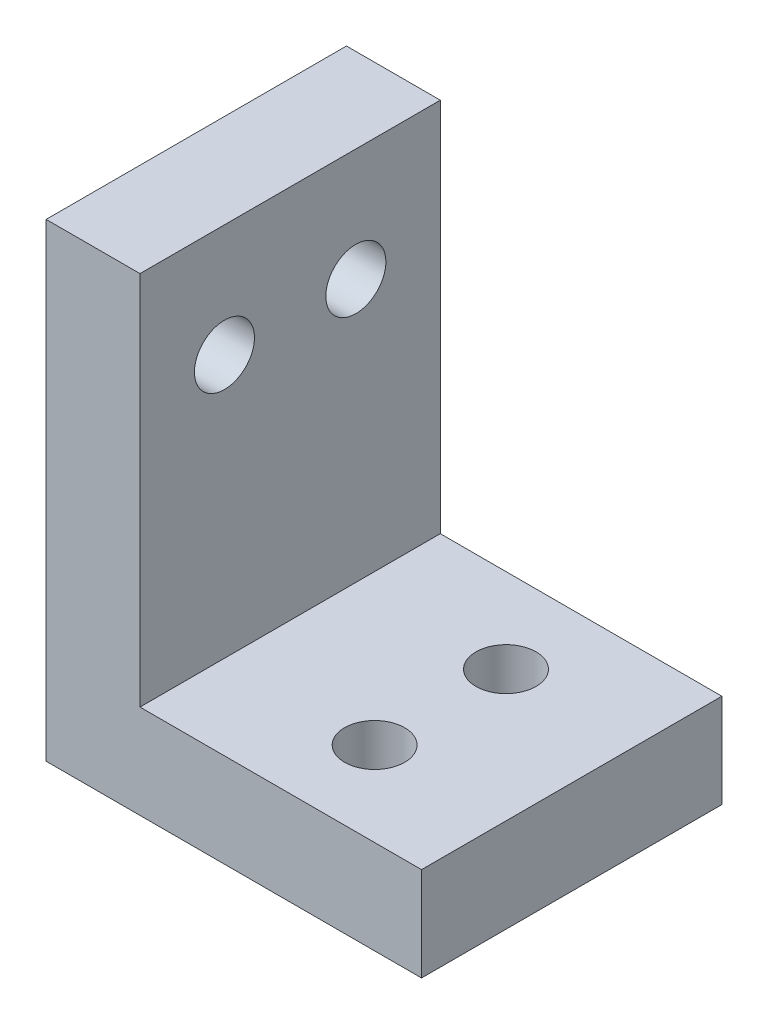
ISO-10303-21;
HEADER;
FILE_DESCRIPTION(('STEP AP214'),'2;1');
FILE_NAME('part.step','',(''),(''),'','','');
FILE_SCHEMA(('AUTOMOTIVE_DESIGN { 1 0 10303 214 1 1 1 1 }'));
ENDSEC;
DATA;
#1=APPLICATION_CONTEXT('core data for automotive mechanical design processes');
#2=APPLICATION_PROTOCOL_DEFINITION('international standard','automotive_design',2000,#1);
#3=PRODUCT_CONTEXT('',#1,'mechanical');
#4=PRODUCT('Part','Part','',(#3));
#5=PRODUCT_RELATED_PRODUCT_CATEGORY('part','',(#4));
#6=PRODUCT_DEFINITION_FORMATION('','',#4);
#7=PRODUCT_DEFINITION_CONTEXT('part definition',#1,'design');
#8=PRODUCT_DEFINITION('design','',#6,#7);
#9=PRODUCT_DEFINITION_SHAPE('','',#8);
#10=(LENGTH_UNIT() NAMED_UNIT(*) SI_UNIT(.MILLI.,.METRE.));
#11=(NAMED_UNIT(*) PLANE_ANGLE_UNIT() SI_UNIT($,.RADIAN.));
#12=(NAMED_UNIT(*) SI_UNIT($,.STERADIAN.) SOLID_ANGLE_UNIT());
#13=UNCERTAINTY_MEASURE_WITH_UNIT(LENGTH_MEASURE(1.E-05),#10,'distance_accuracy_value','');
#14=(GEOMETRIC_REPRESENTATION_CONTEXT(3) GLOBAL_UNCERTAINTY_ASSIGNED_CONTEXT((#13)) GLOBAL_UNIT_ASSIGNED_CONTEXT((#10,
#11,#12)) REPRESENTATION_CONTEXT('',''));
#15=CARTESIAN_POINT('',(0.,0.,0.));
#16=DIRECTION('',(0.,0.,1.));
#17=DIRECTION('',(1.,0.,0.));
#18=AXIS2_PLACEMENT_3D('',#15,#16,#17);
#19=CARTESIAN_POINT('',(5.,25.,16.));
#20=DIRECTION('',(0.,-1.,0.));
#21=DIRECTION('',(0.,0.,-1.));
#22=AXIS2_PLACEMENT_3D('',#19,#20,#21);
#23=PLANE('',#22);
#24=DIRECTION('',(-1.,0.,0.));
#25=VECTOR('',#24,1.);
#26=CARTESIAN_POINT('',(5.,25.,0.));
#27=LINE('',#26,#25);
#28=CARTESIAN_POINT('',(5.,25.,0.));
#29=VERTEX_POINT('',#28);
#30=CARTESIAN_POINT('',(0.,25.,0.));
#31=VERTEX_POINT('',#30);
#32=EDGE_CURVE('E121',#29,#31,#27,.T.);
#33=ORIENTED_EDGE('',*,*,#32,.T.);
#34=DIRECTION('',(0.,0.,-1.));
#35=VECTOR('',#34,1.);
#36=CARTESIAN_POINT('',(0.,25.,16.));
#37=LINE('',#36,#35);
#38=CARTESIAN_POINT('',(0.,25.,16.));
#39=VERTEX_POINT('',#38);
#40=EDGE_CURVE('E11',#39,#31,#37,.T.);
#41=ORIENTED_EDGE('',*,*,#40,.F.);
#42=DIRECTION('',(-1.,0.,0.));
#43=VECTOR('',#42,1.);
#44=CARTESIAN_POINT('',(5.,25.,16.));
#45=LINE('',#44,#43);
#46=CARTESIAN_POINT('',(5.,25.,16.));
#47=VERTEX_POINT('',#46);
#48=EDGE_CURVE('E132',#47,#39,#45,.T.);
#49=ORIENTED_EDGE('',*,*,#48,.F.);
#50=DIRECTION('',(0.,0.,-1.));
#51=VECTOR('',#50,1.);
#52=CARTESIAN_POINT('',(5.,25.,16.));
#53=LINE('',#52,#51);
#54=EDGE_CURVE('E117',#47,#29,#53,.T.);
#55=ORIENTED_EDGE('',*,*,#54,.T.);
#56=EDGE_LOOP('',(#33,#41,#49,#55));
#57=FACE_BOUND('',#56,.T.);
#58=ADVANCED_FACE('F35',(#57),#23,.F.);
#59=CARTESIAN_POINT('',(0.,25.,16.));
#60=DIRECTION('',(1.,0.,0.));
#61=DIRECTION('',(0.,1.,0.));
#62=AXIS2_PLACEMENT_3D('',#59,#60,#61);
#63=PLANE('',#62);
#64=CARTESIAN_POINT('',(0.,19.,11.5));
#65=DIRECTION('',(-1.,0.,0.));
#66=DIRECTION('',(0.,-1.,0.));
#67=AXIS2_PLACEMENT_3D('',#64,#65,#66);
#68=CIRCLE('',#67,1.6);
#69=CARTESIAN_POINT('',(0.,17.4,11.5));
#70=VERTEX_POINT('',#69);
#71=EDGE_CURVE('E139',#70,#70,#68,.T.);
#72=ORIENTED_EDGE('',*,*,#71,.F.);
#73=EDGE_LOOP('',(#72));
#74=FACE_BOUND('',#73,.T.);
#75=CARTESIAN_POINT('',(0.,19.,4.5));
#76=DIRECTION('',(-1.,0.,0.));
#77=DIRECTION('',(0.,-1.,0.));
#78=AXIS2_PLACEMENT_3D('',#75,#76,#77);
#79=CIRCLE('',#78,1.6);
#80=CARTESIAN_POINT('',(0.,17.4,4.5));
#81=VERTEX_POINT('',#80);
#82=EDGE_CURVE('E145',#81,#81,#79,.T.);
#83=ORIENTED_EDGE('',*,*,#82,.F.);
#84=EDGE_LOOP('',(#83));
#85=FACE_BOUND('',#84,.T.);
#86=DIRECTION('',(0.,-1.,0.));
#87=VECTOR('',#86,1.);
#88=CARTESIAN_POINT('',(0.,25.,0.));
#89=LINE('',#88,#87);
#90=CARTESIAN_POINT('',(0.,0.,0.));
#91=VERTEX_POINT('',#90);
#92=EDGE_CURVE('E124',#31,#91,#89,.T.);
#93=ORIENTED_EDGE('',*,*,#92,.T.);
#94=DIRECTION('',(0.,0.,-1.));
#95=VECTOR('',#94,1.);
#96=CARTESIAN_POINT('',(0.,0.,16.));
#97=LINE('',#96,#95);
#98=CARTESIAN_POINT('',(0.,0.,16.));
#99=VERTEX_POINT('',#98);
#100=EDGE_CURVE('E44',#99,#91,#97,.T.);
#101=ORIENTED_EDGE('',*,*,#100,.F.);
#102=DIRECTION('',(0.,-1.,0.));
#103=VECTOR('',#102,1.);
#104=CARTESIAN_POINT('',(0.,25.,16.));
#105=LINE('',#104,#103);
#106=EDGE_CURVE('E90',#39,#99,#105,.T.);
#107=ORIENTED_EDGE('',*,*,#106,.F.);
#108=ORIENTED_EDGE('',*,*,#40,.T.);
#109=EDGE_LOOP('',(#93,#101,#107,#108));
#110=FACE_BOUND('',#109,.T.);
#111=ADVANCED_FACE('F165',(#74,#85,#110),#63,.F.);
#112=CARTESIAN_POINT('',(0.,0.,16.));
#113=DIRECTION('',(0.,1.,0.));
#114=DIRECTION('',(0.,0.,1.));
#115=AXIS2_PLACEMENT_3D('',#112,#113,#114);
#116=PLANE('',#115);
#117=CARTESIAN_POINT('',(13.,0.,4.5));
#118=DIRECTION('',(0.,1.,0.));
#119=DIRECTION('',(0.,0.,1.));
#120=AXIS2_PLACEMENT_3D('',#117,#118,#119);
#121=CIRCLE('',#120,1.6);
#122=CARTESIAN_POINT('',(13.,0.,6.1));
#123=VERTEX_POINT('',#122);
#124=EDGE_CURVE('E125',#123,#123,#121,.T.);
#125=ORIENTED_EDGE('',*,*,#124,.T.);
#126=EDGE_LOOP('',(#125));
#127=FACE_BOUND('',#126,.T.);
#128=CARTESIAN_POINT('',(13.,0.,11.5));
#129=DIRECTION('',(0.,1.,0.));
#130=DIRECTION('',(0.,0.,1.));
#131=AXIS2_PLACEMENT_3D('',#128,#129,#130);
#132=CIRCLE('',#131,1.6);
#133=CARTESIAN_POINT('',(13.,0.,13.1));
#134=VERTEX_POINT('',#133);
#135=EDGE_CURVE('E155',#134,#134,#132,.T.);
#136=ORIENTED_EDGE('',*,*,#135,.T.);
#137=EDGE_LOOP('',(#136));
#138=FACE_BOUND('',#137,.T.);
#139=DIRECTION('',(1.,0.,0.));
#140=VECTOR('',#139,1.);
#141=CARTESIAN_POINT('',(0.,0.,0.));
#142=LINE('',#141,#140);
#143=CARTESIAN_POINT('',(20.,0.,0.));
#144=VERTEX_POINT('',#143);
#145=EDGE_CURVE('E127',#91,#144,#142,.T.);
#146=ORIENTED_EDGE('',*,*,#145,.T.);
#147=DIRECTION('',(0.,0.,-1.));
#148=VECTOR('',#147,1.);
#149=CARTESIAN_POINT('',(20.,0.,16.));
#150=LINE('',#149,#148);
#151=CARTESIAN_POINT('',(20.,0.,16.));
#152=VERTEX_POINT('',#151);
#153=EDGE_CURVE('E112',#152,#144,#150,.T.);
#154=ORIENTED_EDGE('',*,*,#153,.F.);
#155=DIRECTION('',(1.,0.,0.));
#156=VECTOR('',#155,1.);
#157=CARTESIAN_POINT('',(0.,0.,16.));
#158=LINE('',#157,#156);
#159=EDGE_CURVE('E103',#99,#152,#158,.T.);
#160=ORIENTED_EDGE('',*,*,#159,.F.);
#161=ORIENTED_EDGE('',*,*,#100,.T.);
#162=EDGE_LOOP('',(#146,#154,#160,#161));
#163=FACE_BOUND('',#162,.T.);
#164=ADVANCED_FACE('F168',(#127,#138,#163),#116,.F.);
#165=CARTESIAN_POINT('',(20.,0.,16.));
#166=DIRECTION('',(-1.,0.,0.));
#167=DIRECTION('',(0.,0.,1.));
#168=AXIS2_PLACEMENT_3D('',#165,#166,#167);
#169=PLANE('',#168);
#170=DIRECTION('',(0.,1.,0.));
#171=VECTOR('',#170,1.);
#172=CARTESIAN_POINT('',(20.,0.,0.));
#173=LINE('',#172,#171);
#174=CARTESIAN_POINT('',(20.,5.,0.));
#175=VERTEX_POINT('',#174);
#176=EDGE_CURVE('E111',#144,#175,#173,.T.);
#177=ORIENTED_EDGE('',*,*,#176,.T.);
#178=DIRECTION('',(0.,0.,-1.));
#179=VECTOR('',#178,1.);
#180=CARTESIAN_POINT('',(20.,5.,16.));
#181=LINE('',#180,#179);
#182=CARTESIAN_POINT('',(20.,5.,16.));
#183=VERTEX_POINT('',#182);
#184=EDGE_CURVE('E108',#183,#175,#181,.T.);
#185=ORIENTED_EDGE('',*,*,#184,.F.);
#186=DIRECTION('',(0.,1.,0.));
#187=VECTOR('',#186,1.);
#188=CARTESIAN_POINT('',(20.,0.,16.));
#189=LINE('',#188,#187);
#190=EDGE_CURVE('E97',#152,#183,#189,.T.);
#191=ORIENTED_EDGE('',*,*,#190,.F.);
#192=ORIENTED_EDGE('',*,*,#153,.T.);
#193=EDGE_LOOP('',(#177,#185,#191,#192));
#194=FACE_BOUND('',#193,.T.);
#195=ADVANCED_FACE('F109',(#194),#169,.F.);
#196=CARTESIAN_POINT('',(20.,5.,16.));
#197=DIRECTION('',(0.,-1.,0.));
#198=DIRECTION('',(1.,0.,0.));
#199=AXIS2_PLACEMENT_3D('',#196,#197,#198);
#200=PLANE('',#199);
#201=CARTESIAN_POINT('',(13.,5.,4.5));
#202=DIRECTION('',(0.,1.,0.));
#203=DIRECTION('',(-1.,0.,0.));
#204=AXIS2_PLACEMENT_3D('',#201,#202,#203);
#205=CIRCLE('',#204,1.6);
#206=CARTESIAN_POINT('',(11.4,5.,4.5));
#207=VERTEX_POINT('',#206);
#208=EDGE_CURVE('E152',#207,#207,#205,.T.);
#209=ORIENTED_EDGE('',*,*,#208,.F.);
#210=EDGE_LOOP('',(#209));
#211=FACE_BOUND('',#210,.T.);
#212=CARTESIAN_POINT('',(13.,5.,11.5));
#213=DIRECTION('',(0.,1.,0.));
#214=DIRECTION('',(-1.,0.,0.));
#215=AXIS2_PLACEMENT_3D('',#212,#213,#214);
#216=CIRCLE('',#215,1.6);
#217=CARTESIAN_POINT('',(11.4,5.,11.5));
#218=VERTEX_POINT('',#217);
#219=EDGE_CURVE('E143',#218,#218,#216,.T.);
#220=ORIENTED_EDGE('',*,*,#219,.F.);
#221=EDGE_LOOP('',(#220));
#222=FACE_BOUND('',#221,.T.);
#223=DIRECTION('',(-1.,0.,0.));
#224=VECTOR('',#223,1.);
#225=CARTESIAN_POINT('',(20.,5.,0.));
#226=LINE('',#225,#224);
#227=CARTESIAN_POINT('',(5.,5.,0.));
#228=VERTEX_POINT('',#227);
#229=EDGE_CURVE('E76',#175,#228,#226,.T.);
#230=ORIENTED_EDGE('',*,*,#229,.T.);
#231=DIRECTION('',(0.,0.,-1.));
#232=VECTOR('',#231,1.);
#233=CARTESIAN_POINT('',(5.,5.,16.));
#234=LINE('',#233,#232);
#235=CARTESIAN_POINT('',(5.,5.,16.));
#236=VERTEX_POINT('',#235);
#237=EDGE_CURVE('E113',#236,#228,#234,.T.);
#238=ORIENTED_EDGE('',*,*,#237,.F.);
#239=DIRECTION('',(-1.,0.,0.));
#240=VECTOR('',#239,1.);
#241=CARTESIAN_POINT('',(20.,5.,16.));
#242=LINE('',#241,#240);
#243=EDGE_CURVE('E101',#183,#236,#242,.T.);
#244=ORIENTED_EDGE('',*,*,#243,.F.);
#245=ORIENTED_EDGE('',*,*,#184,.T.);
#246=EDGE_LOOP('',(#230,#238,#244,#245));
#247=FACE_BOUND('',#246,.T.);
#248=ADVANCED_FACE('F115',(#211,#222,#247),#200,.F.);
#249=CARTESIAN_POINT('',(5.,5.,16.));
#250=DIRECTION('',(-1.,0.,0.));
#251=DIRECTION('',(0.,-1.,0.));
#252=AXIS2_PLACEMENT_3D('',#249,#250,#251);
#253=PLANE('',#252);
#254=CARTESIAN_POINT('',(5.,19.,11.5));
#255=DIRECTION('',(-1.,0.,0.));
#256=DIRECTION('',(0.,-1.,0.));
#257=AXIS2_PLACEMENT_3D('',#254,#255,#256);
#258=CIRCLE('',#257,1.6);
#259=CARTESIAN_POINT('',(5.,17.4,11.5));
#260=VERTEX_POINT('',#259);
#261=EDGE_CURVE('E38',#260,#260,#258,.T.);
#262=ORIENTED_EDGE('',*,*,#261,.T.);
#263=EDGE_LOOP('',(#262));
#264=FACE_BOUND('',#263,.T.);
#265=CARTESIAN_POINT('',(5.,19.,4.5));
#266=DIRECTION('',(-1.,0.,0.));
#267=DIRECTION('',(0.,-1.,0.));
#268=AXIS2_PLACEMENT_3D('',#265,#266,#267);
#269=CIRCLE('',#268,1.6);
#270=CARTESIAN_POINT('',(5.,17.4,4.5));
#271=VERTEX_POINT('',#270);
#272=EDGE_CURVE('E137',#271,#271,#269,.T.);
#273=ORIENTED_EDGE('',*,*,#272,.T.);
#274=EDGE_LOOP('',(#273));
#275=FACE_BOUND('',#274,.T.);
#276=DIRECTION('',(0.,1.,0.));
#277=VECTOR('',#276,1.);
#278=CARTESIAN_POINT('',(5.,5.,0.));
#279=LINE('',#278,#277);
#280=EDGE_CURVE('E82',#228,#29,#279,.T.);
#281=ORIENTED_EDGE('',*,*,#280,.T.);
#282=ORIENTED_EDGE('',*,*,#54,.F.);
#283=DIRECTION('',(0.,1.,0.));
#284=VECTOR('',#283,1.);
#285=CARTESIAN_POINT('',(5.,5.,16.));
#286=LINE('',#285,#284);
#287=EDGE_CURVE('E53',#236,#47,#286,.T.);
#288=ORIENTED_EDGE('',*,*,#287,.F.);
#289=ORIENTED_EDGE('',*,*,#237,.T.);
#290=EDGE_LOOP('',(#281,#282,#288,#289));
#291=FACE_BOUND('',#290,.T.);
#292=ADVANCED_FACE('F173',(#264,#275,#291),#253,.F.);
#293=CARTESIAN_POINT('',(0.,0.,16.));
#294=DIRECTION('',(0.,0.,1.));
#295=DIRECTION('',(1.,0.,0.));
#296=AXIS2_PLACEMENT_3D('',#293,#294,#295);
#297=PLANE('',#296);
#298=ORIENTED_EDGE('',*,*,#48,.T.);
#299=ORIENTED_EDGE('',*,*,#106,.T.);
#300=ORIENTED_EDGE('',*,*,#159,.T.);
#301=ORIENTED_EDGE('',*,*,#190,.T.);
#302=ORIENTED_EDGE('',*,*,#243,.T.);
#303=ORIENTED_EDGE('',*,*,#287,.T.);
#304=EDGE_LOOP('',(#298,#299,#300,#301,#302,#303));
#305=FACE_BOUND('',#304,.T.);
#306=ADVANCED_FACE('F99',(#305),#297,.T.);
#307=CARTESIAN_POINT('',(0.,0.,0.));
#308=DIRECTION('',(0.,0.,1.));
#309=DIRECTION('',(1.,0.,0.));
#310=AXIS2_PLACEMENT_3D('',#307,#308,#309);
#311=PLANE('',#310);
#312=ORIENTED_EDGE('',*,*,#32,.F.);
#313=ORIENTED_EDGE('',*,*,#280,.F.);
#314=ORIENTED_EDGE('',*,*,#229,.F.);
#315=ORIENTED_EDGE('',*,*,#176,.F.);
#316=ORIENTED_EDGE('',*,*,#145,.F.);
#317=ORIENTED_EDGE('',*,*,#92,.F.);
#318=EDGE_LOOP('',(#312,#313,#314,#315,#316,#317));
#319=FACE_BOUND('',#318,.T.);
#320=ADVANCED_FACE('F171',(#319),#311,.F.);
#321=CARTESIAN_POINT('',(13.,-33.,11.5));
#322=DIRECTION('',(0.,1.,0.));
#323=DIRECTION('',(-1.,0.,0.));
#324=AXIS2_PLACEMENT_3D('',#321,#322,#323);
#325=CYLINDRICAL_SURFACE('',#324,1.6);
#326=ORIENTED_EDGE('',*,*,#219,.T.);
#327=EDGE_LOOP('',(#326));
#328=FACE_BOUND('',#327,.T.);
#329=ORIENTED_EDGE('',*,*,#135,.F.);
#330=EDGE_LOOP('',(#329));
#331=FACE_BOUND('',#330,.T.);
#332=ADVANCED_FACE('F216',(#328,#331),#325,.F.);
#333=CARTESIAN_POINT('',(13.,-33.,4.5));
#334=DIRECTION('',(0.,1.,0.));
#335=DIRECTION('',(-1.,0.,0.));
#336=AXIS2_PLACEMENT_3D('',#333,#334,#335);
#337=CYLINDRICAL_SURFACE('',#336,1.6);
#338=ORIENTED_EDGE('',*,*,#208,.T.);
#339=EDGE_LOOP('',(#338));
#340=FACE_BOUND('',#339,.T.);
#341=ORIENTED_EDGE('',*,*,#124,.F.);
#342=EDGE_LOOP('',(#341));
#343=FACE_BOUND('',#342,.T.);
#344=ADVANCED_FACE('F221',(#340,#343),#337,.F.);
#345=CARTESIAN_POINT('',(38.,19.,4.5));
#346=DIRECTION('',(-1.,0.,0.));
#347=DIRECTION('',(0.,-1.,0.));
#348=AXIS2_PLACEMENT_3D('',#345,#346,#347);
#349=CYLINDRICAL_SURFACE('',#348,1.6);
#350=ORIENTED_EDGE('',*,*,#82,.T.);
#351=EDGE_LOOP('',(#350));
#352=FACE_BOUND('',#351,.T.);
#353=ORIENTED_EDGE('',*,*,#272,.F.);
#354=EDGE_LOOP('',(#353));
#355=FACE_BOUND('',#354,.T.);
#356=ADVANCED_FACE('F232',(#352,#355),#349,.F.);
#357=CARTESIAN_POINT('',(38.,19.,11.5));
#358=DIRECTION('',(-1.,0.,0.));
#359=DIRECTION('',(0.,-1.,0.));
#360=AXIS2_PLACEMENT_3D('',#357,#358,#359);
#361=CYLINDRICAL_SURFACE('',#360,1.6);
#362=ORIENTED_EDGE('',*,*,#71,.T.);
#363=EDGE_LOOP('',(#362));
#364=FACE_BOUND('',#363,.T.);
#365=ORIENTED_EDGE('',*,*,#261,.F.);
#366=EDGE_LOOP('',(#365));
#367=FACE_BOUND('',#366,.T.);
#368=ADVANCED_FACE('F252',(#364,#367),#361,.F.);
#369=CLOSED_SHELL('',(#58,#111,#164,#195,#248,#292,#306,#320,#332,#344,#356,#368));
#370=MANIFOLD_SOLID_BREP('B2',#369);
#371=ADVANCED_BREP_SHAPE_REPRESENTATION('',(#18,#370),#14);
#372=SHAPE_DEFINITION_REPRESENTATION(#9,#371);
ENDSEC;
END-ISO-10303-21;
